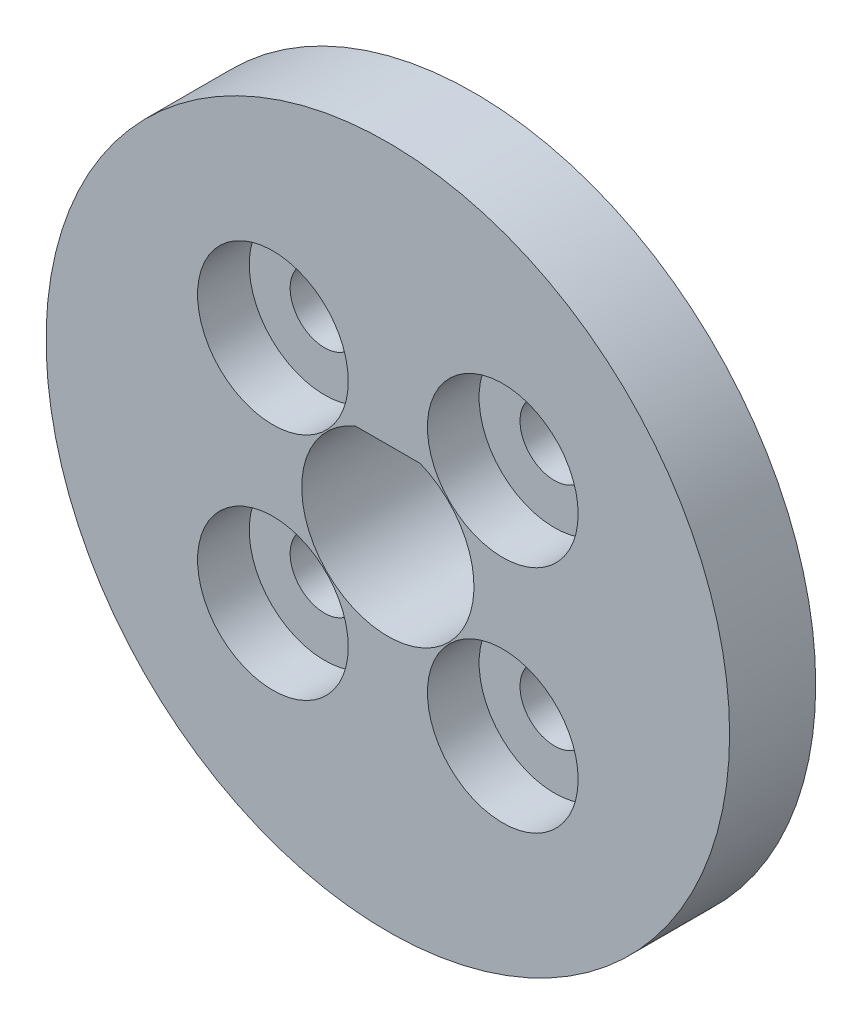
ISO-10303-21;
HEADER;
FILE_DESCRIPTION(('STEP AP214'),'2;1');
FILE_NAME('part.step','',(''),(''),'','','');
FILE_SCHEMA(('AUTOMOTIVE_DESIGN { 1 0 10303 214 1 1 1 1 }'));
ENDSEC;
DATA;
#1=APPLICATION_CONTEXT('core data for automotive mechanical design processes');
#2=APPLICATION_PROTOCOL_DEFINITION('international standard','automotive_design',2000,#1);
#3=PRODUCT_CONTEXT('',#1,'mechanical');
#4=PRODUCT('Part','Part','',(#3));
#5=PRODUCT_RELATED_PRODUCT_CATEGORY('part','',(#4));
#6=PRODUCT_DEFINITION_FORMATION('','',#4);
#7=PRODUCT_DEFINITION_CONTEXT('part definition',#1,'design');
#8=PRODUCT_DEFINITION('design','',#6,#7);
#9=PRODUCT_DEFINITION_SHAPE('','',#8);
#10=(LENGTH_UNIT() NAMED_UNIT(*) SI_UNIT(.MILLI.,.METRE.));
#11=(NAMED_UNIT(*) PLANE_ANGLE_UNIT() SI_UNIT($,.RADIAN.));
#12=(NAMED_UNIT(*) SI_UNIT($,.STERADIAN.) SOLID_ANGLE_UNIT());
#13=UNCERTAINTY_MEASURE_WITH_UNIT(LENGTH_MEASURE(1.E-05),#10,'distance_accuracy_value','');
#14=(GEOMETRIC_REPRESENTATION_CONTEXT(3) GLOBAL_UNCERTAINTY_ASSIGNED_CONTEXT((#13)) GLOBAL_UNIT_ASSIGNED_CONTEXT((#10,
#11,#12)) REPRESENTATION_CONTEXT('',''));
#15=CARTESIAN_POINT('',(0.,0.,0.));
#16=DIRECTION('',(0.,0.,1.));
#17=DIRECTION('',(1.,0.,0.));
#18=AXIS2_PLACEMENT_3D('',#15,#16,#17);
#19=CARTESIAN_POINT('',(15.875,98.8856531004278,-3.));
#20=DIRECTION('',(0.,0.,-1.));
#21=DIRECTION('',(-1.,0.,0.));
#22=AXIS2_PLACEMENT_3D('',#19,#20,#21);
#23=PLANE('',#22);
#24=CARTESIAN_POINT('',(15.875,98.8856531004278,-3.));
#25=DIRECTION('',(0.,0.,-1.));
#26=DIRECTION('',(-1.,0.,0.));
#27=AXIS2_PLACEMENT_3D('',#24,#25,#26);
#28=CIRCLE('',#27,4.);
#29=CARTESIAN_POINT('',(17.375,102.593752343976,-3.));
#30=VERTEX_POINT('',#29);
#31=CARTESIAN_POINT('',(14.375,102.593752343976,-3.));
#32=VERTEX_POINT('',#31);
#33=EDGE_CURVE('E11',#30,#32,#28,.T.);
#34=ORIENTED_EDGE('',*,*,#33,.F.);
#35=DIRECTION('',(1.,0.,0.));
#36=VECTOR('',#35,1.);
#37=CARTESIAN_POINT('',(15.875,102.593752343976,-3.));
#38=LINE('',#37,#36);
#39=EDGE_CURVE('E45',#32,#30,#38,.T.);
#40=ORIENTED_EDGE('',*,*,#39,.F.);
#41=EDGE_LOOP('',(#34,#40));
#42=FACE_BOUND('',#41,.T.);
#43=CARTESIAN_POINT('',(10.5363438020416,104.224309298386,-3.));
#44=DIRECTION('',(0.,0.,1.));
#45=DIRECTION('',(1.,0.,0.));
#46=AXIS2_PLACEMENT_3D('',#43,#44,#45);
#47=CIRCLE('',#46,1.6);
#48=CARTESIAN_POINT('',(12.1363438020416,104.224309298386,-3.));
#49=VERTEX_POINT('',#48);
#50=EDGE_CURVE('E80',#49,#49,#47,.T.);
#51=ORIENTED_EDGE('',*,*,#50,.T.);
#52=EDGE_LOOP('',(#51));
#53=FACE_BOUND('',#52,.T.);
#54=CARTESIAN_POINT('',(21.2136561979584,104.224309298386,-3.));
#55=DIRECTION('',(0.,0.,1.));
#56=DIRECTION('',(1.,0.,0.));
#57=AXIS2_PLACEMENT_3D('',#54,#55,#56);
#58=CIRCLE('',#57,1.6);
#59=CARTESIAN_POINT('',(22.8136561979584,104.224309298386,-3.));
#60=VERTEX_POINT('',#59);
#61=EDGE_CURVE('E84',#60,#60,#58,.T.);
#62=ORIENTED_EDGE('',*,*,#61,.T.);
#63=EDGE_LOOP('',(#62));
#64=FACE_BOUND('',#63,.T.);
#65=CARTESIAN_POINT('',(21.2136561979582,93.5469969024693,-3.));
#66=DIRECTION('',(0.,0.,1.));
#67=DIRECTION('',(1.,0.,0.));
#68=AXIS2_PLACEMENT_3D('',#65,#66,#67);
#69=CIRCLE('',#68,1.6);
#70=CARTESIAN_POINT('',(22.8136561979582,93.5469969024693,-3.));
#71=VERTEX_POINT('',#70);
#72=EDGE_CURVE('E88',#71,#71,#69,.T.);
#73=ORIENTED_EDGE('',*,*,#72,.T.);
#74=EDGE_LOOP('',(#73));
#75=FACE_BOUND('',#74,.T.);
#76=CARTESIAN_POINT('',(15.875,98.8856531004278,-3.));
#77=DIRECTION('',(0.,0.,-1.));
#78=DIRECTION('',(-1.,0.,0.));
#79=AXIS2_PLACEMENT_3D('',#76,#77,#78);
#80=CIRCLE('',#79,10.);
#81=CARTESIAN_POINT('',(5.875,98.8856531004278,-3.));
#82=VERTEX_POINT('',#81);
#83=EDGE_CURVE('E92',#82,#82,#80,.T.);
#84=ORIENTED_EDGE('',*,*,#83,.T.);
#85=EDGE_LOOP('',(#84));
#86=FACE_BOUND('',#85,.T.);
#87=CARTESIAN_POINT('',(10.5363438020413,93.5469969024696,-3.));
#88=DIRECTION('',(0.,0.,1.));
#89=DIRECTION('',(1.,0.,0.));
#90=AXIS2_PLACEMENT_3D('',#87,#88,#89);
#91=CIRCLE('',#90,1.6);
#92=CARTESIAN_POINT('',(12.1363438020413,93.5469969024696,-3.));
#93=VERTEX_POINT('',#92);
#94=EDGE_CURVE('E95',#93,#93,#91,.T.);
#95=ORIENTED_EDGE('',*,*,#94,.T.);
#96=EDGE_LOOP('',(#95));
#97=FACE_BOUND('',#96,.T.);
#98=ADVANCED_FACE('F37',(#42,#53,#64,#75,#86,#97),#23,.T.);
#99=CARTESIAN_POINT('',(15.875,98.8856531004278,4.));
#100=DIRECTION('',(0.,0.,1.));
#101=DIRECTION('',(1.,0.,0.));
#102=AXIS2_PLACEMENT_3D('',#99,#100,#101);
#103=PLANE('',#102);
#104=CARTESIAN_POINT('',(10.5363438020416,104.224309298386,4.));
#105=DIRECTION('',(0.,0.,1.));
#106=DIRECTION('',(1.,0.,0.));
#107=AXIS2_PLACEMENT_3D('',#104,#105,#106);
#108=CIRCLE('',#107,3.5);
#109=CARTESIAN_POINT('',(14.0363438020416,104.224309298386,4.));
#110=VERTEX_POINT('',#109);
#111=EDGE_CURVE('E68',#110,#110,#108,.T.);
#112=ORIENTED_EDGE('',*,*,#111,.F.);
#113=EDGE_LOOP('',(#112));
#114=FACE_BOUND('',#113,.T.);
#115=CARTESIAN_POINT('',(21.2136561979584,104.224309298386,4.));
#116=DIRECTION('',(0.,0.,1.));
#117=DIRECTION('',(1.,0.,0.));
#118=AXIS2_PLACEMENT_3D('',#115,#116,#117);
#119=CIRCLE('',#118,3.5);
#120=CARTESIAN_POINT('',(24.7136561979584,104.224309298386,4.));
#121=VERTEX_POINT('',#120);
#122=EDGE_CURVE('E148',#121,#121,#119,.T.);
#123=ORIENTED_EDGE('',*,*,#122,.F.);
#124=EDGE_LOOP('',(#123));
#125=FACE_BOUND('',#124,.T.);
#126=CARTESIAN_POINT('',(21.2136561979582,93.5469969024693,4.));
#127=DIRECTION('',(0.,0.,1.));
#128=DIRECTION('',(1.,0.,0.));
#129=AXIS2_PLACEMENT_3D('',#126,#127,#128);
#130=CIRCLE('',#129,3.5);
#131=CARTESIAN_POINT('',(24.7136561979582,93.5469969024693,4.));
#132=VERTEX_POINT('',#131);
#133=EDGE_CURVE('E158',#132,#132,#130,.T.);
#134=ORIENTED_EDGE('',*,*,#133,.F.);
#135=EDGE_LOOP('',(#134));
#136=FACE_BOUND('',#135,.T.);
#137=CARTESIAN_POINT('',(10.5363438020413,93.5469969024696,4.));
#138=DIRECTION('',(0.,0.,1.));
#139=DIRECTION('',(1.,0.,0.));
#140=AXIS2_PLACEMENT_3D('',#137,#138,#139);
#141=CIRCLE('',#140,3.5);
#142=CARTESIAN_POINT('',(14.0363438020413,93.5469969024696,4.));
#143=VERTEX_POINT('',#142);
#144=EDGE_CURVE('E168',#143,#143,#141,.T.);
#145=ORIENTED_EDGE('',*,*,#144,.F.);
#146=EDGE_LOOP('',(#145));
#147=FACE_BOUND('',#146,.T.);
#148=CARTESIAN_POINT('',(15.875,98.8856531004278,4.));
#149=DIRECTION('',(0.,0.,1.));
#150=DIRECTION('',(1.,0.,0.));
#151=AXIS2_PLACEMENT_3D('',#148,#149,#150);
#152=CIRCLE('',#151,15.875);
#153=CARTESIAN_POINT('',(31.75,98.8856531004278,4.));
#154=VERTEX_POINT('',#153);
#155=EDGE_CURVE('E107',#154,#154,#152,.T.);
#156=ORIENTED_EDGE('',*,*,#155,.T.);
#157=EDGE_LOOP('',(#156));
#158=FACE_BOUND('',#157,.T.);
#159=CARTESIAN_POINT('',(15.875,98.8856531004278,4.));
#160=DIRECTION('',(0.,0.,1.));
#161=DIRECTION('',(1.,0.,0.));
#162=AXIS2_PLACEMENT_3D('',#159,#160,#161);
#163=CIRCLE('',#162,4.);
#164=CARTESIAN_POINT('',(14.375,102.593752343976,4.));
#165=VERTEX_POINT('',#164);
#166=CARTESIAN_POINT('',(17.375,102.593752343976,4.));
#167=VERTEX_POINT('',#166);
#168=EDGE_CURVE('E67',#165,#167,#163,.T.);
#169=ORIENTED_EDGE('',*,*,#168,.F.);
#170=DIRECTION('',(1.,0.,0.));
#171=VECTOR('',#170,1.);
#172=CARTESIAN_POINT('',(14.375,102.593752343976,4.));
#173=LINE('',#172,#171);
#174=EDGE_CURVE('E135',#165,#167,#173,.T.);
#175=ORIENTED_EDGE('',*,*,#174,.T.);
#176=EDGE_LOOP('',(#169,#175));
#177=FACE_BOUND('',#176,.T.);
#178=ADVANCED_FACE('F75',(#114,#125,#136,#147,#158,#177),#103,.T.);
#179=CARTESIAN_POINT('',(15.875,98.8856531004278,0.));
#180=DIRECTION('',(0.,0.,1.));
#181=DIRECTION('',(1.,0.,0.));
#182=AXIS2_PLACEMENT_3D('',#179,#180,#181);
#183=PLANE('',#182);
#184=CARTESIAN_POINT('',(15.875,98.8856531004278,0.));
#185=DIRECTION('',(0.,0.,1.));
#186=DIRECTION('',(1.,0.,0.));
#187=AXIS2_PLACEMENT_3D('',#184,#185,#186);
#188=CIRCLE('',#187,10.);
#189=CARTESIAN_POINT('',(25.875,98.8856531004278,0.));
#190=VERTEX_POINT('',#189);
#191=EDGE_CURVE('E72',#190,#190,#188,.F.);
#192=ORIENTED_EDGE('',*,*,#191,.F.);
#193=EDGE_LOOP('',(#192));
#194=FACE_BOUND('',#193,.T.);
#195=CARTESIAN_POINT('',(15.875,98.8856531004278,0.));
#196=DIRECTION('',(0.,0.,1.));
#197=DIRECTION('',(1.,0.,0.));
#198=AXIS2_PLACEMENT_3D('',#195,#196,#197);
#199=CIRCLE('',#198,15.875);
#200=CARTESIAN_POINT('',(31.75,98.8856531004278,0.));
#201=VERTEX_POINT('',#200);
#202=EDGE_CURVE('E106',#201,#201,#199,.T.);
#203=ORIENTED_EDGE('',*,*,#202,.F.);
#204=EDGE_LOOP('',(#203));
#205=FACE_BOUND('',#204,.T.);
#206=ADVANCED_FACE('F117',(#194,#205),#183,.F.);
#207=CARTESIAN_POINT('',(15.875,98.8856531004278,4.));
#208=DIRECTION('',(0.,0.,-1.));
#209=DIRECTION('',(-1.,0.,0.));
#210=AXIS2_PLACEMENT_3D('',#207,#208,#209);
#211=CYLINDRICAL_SURFACE('',#210,15.875);
#212=ORIENTED_EDGE('',*,*,#155,.F.);
#213=EDGE_LOOP('',(#212));
#214=FACE_BOUND('',#213,.T.);
#215=ORIENTED_EDGE('',*,*,#202,.T.);
#216=EDGE_LOOP('',(#215));
#217=FACE_BOUND('',#216,.T.);
#218=ADVANCED_FACE('F39',(#214,#217),#211,.T.);
#219=CARTESIAN_POINT('',(15.875,98.8856531004278,4.));
#220=DIRECTION('',(0.,0.,-1.));
#221=DIRECTION('',(-1.,0.,0.));
#222=AXIS2_PLACEMENT_3D('',#219,#220,#221);
#223=CYLINDRICAL_SURFACE('',#222,4.);
#224=DIRECTION('',(0.,0.,1.));
#225=VECTOR('',#224,1.);
#226=CARTESIAN_POINT('',(14.375,102.593752343976,-3.01416755533221));
#227=LINE('',#226,#225);
#228=EDGE_CURVE('E52',#32,#165,#227,.T.);
#229=ORIENTED_EDGE('',*,*,#228,.T.);
#230=ORIENTED_EDGE('',*,*,#168,.T.);
#231=DIRECTION('',(0.,0.,1.));
#232=VECTOR('',#231,1.);
#233=CARTESIAN_POINT('',(17.375,102.593752343976,-3.01416755533221));
#234=LINE('',#233,#232);
#235=EDGE_CURVE('E56',#30,#167,#234,.T.);
#236=ORIENTED_EDGE('',*,*,#235,.F.);
#237=ORIENTED_EDGE('',*,*,#33,.T.);
#238=EDGE_LOOP('',(#229,#230,#236,#237));
#239=FACE_BOUND('',#238,.T.);
#240=ADVANCED_FACE('F63',(#239),#223,.F.);
#241=CARTESIAN_POINT('',(15.875,98.8856531004278,-3.));
#242=DIRECTION('',(0.,0.,1.));
#243=DIRECTION('',(1.,0.,0.));
#244=AXIS2_PLACEMENT_3D('',#241,#242,#243);
#245=CYLINDRICAL_SURFACE('',#244,10.);
#246=ORIENTED_EDGE('',*,*,#83,.F.);
#247=EDGE_LOOP('',(#246));
#248=FACE_BOUND('',#247,.T.);
#249=ORIENTED_EDGE('',*,*,#191,.T.);
#250=EDGE_LOOP('',(#249));
#251=FACE_BOUND('',#250,.T.);
#252=ADVANCED_FACE('F115',(#248,#251),#245,.T.);
#253=CARTESIAN_POINT('',(10.5363438020413,93.5469969024696,4.));
#254=DIRECTION('',(0.,0.,1.));
#255=DIRECTION('',(1.,0.,0.));
#256=AXIS2_PLACEMENT_3D('',#253,#254,#255);
#257=CYLINDRICAL_SURFACE('',#256,1.6);
#258=ORIENTED_EDGE('',*,*,#94,.F.);
#259=EDGE_LOOP('',(#258));
#260=FACE_BOUND('',#259,.T.);
#261=CARTESIAN_POINT('',(10.5363438020413,93.5469969024696,1.6));
#262=DIRECTION('',(0.,0.,1.));
#263=DIRECTION('',(1.,0.,0.));
#264=AXIS2_PLACEMENT_3D('',#261,#262,#263);
#265=CIRCLE('',#264,1.6);
#266=CARTESIAN_POINT('',(12.1363438020413,93.5469969024696,1.6));
#267=VERTEX_POINT('',#266);
#268=EDGE_CURVE('E97',#267,#267,#265,.T.);
#269=ORIENTED_EDGE('',*,*,#268,.T.);
#270=EDGE_LOOP('',(#269));
#271=FACE_BOUND('',#270,.T.);
#272=ADVANCED_FACE('F189',(#260,#271),#257,.F.);
#273=CARTESIAN_POINT('',(12.1363438020413,93.5469969024696,1.6));
#274=DIRECTION('',(0.,0.,-1.));
#275=DIRECTION('',(-1.,0.,0.));
#276=AXIS2_PLACEMENT_3D('',#273,#274,#275);
#277=PLANE('',#276);
#278=ORIENTED_EDGE('',*,*,#268,.F.);
#279=EDGE_LOOP('',(#278));
#280=FACE_BOUND('',#279,.T.);
#281=CARTESIAN_POINT('',(10.5363438020413,93.5469969024696,1.6));
#282=DIRECTION('',(0.,0.,1.));
#283=DIRECTION('',(1.,0.,0.));
#284=AXIS2_PLACEMENT_3D('',#281,#282,#283);
#285=CIRCLE('',#284,3.5);
#286=CARTESIAN_POINT('',(14.0363438020413,93.5469969024696,1.6));
#287=VERTEX_POINT('',#286);
#288=EDGE_CURVE('E101',#287,#287,#285,.T.);
#289=ORIENTED_EDGE('',*,*,#288,.T.);
#290=EDGE_LOOP('',(#289));
#291=FACE_BOUND('',#290,.T.);
#292=ADVANCED_FACE('F173',(#280,#291),#277,.F.);
#293=CARTESIAN_POINT('',(10.5363438020413,93.5469969024696,4.));
#294=DIRECTION('',(0.,0.,1.));
#295=DIRECTION('',(1.,0.,0.));
#296=AXIS2_PLACEMENT_3D('',#293,#294,#295);
#297=CYLINDRICAL_SURFACE('',#296,3.5);
#298=ORIENTED_EDGE('',*,*,#288,.F.);
#299=EDGE_LOOP('',(#298));
#300=FACE_BOUND('',#299,.T.);
#301=ORIENTED_EDGE('',*,*,#144,.T.);
#302=EDGE_LOOP('',(#301));
#303=FACE_BOUND('',#302,.T.);
#304=ADVANCED_FACE('F175',(#300,#303),#297,.F.);
#305=CARTESIAN_POINT('',(21.2136561979582,93.5469969024693,4.));
#306=DIRECTION('',(0.,0.,1.));
#307=DIRECTION('',(1.,0.,0.));
#308=AXIS2_PLACEMENT_3D('',#305,#306,#307);
#309=CYLINDRICAL_SURFACE('',#308,1.6);
#310=ORIENTED_EDGE('',*,*,#72,.F.);
#311=EDGE_LOOP('',(#310));
#312=FACE_BOUND('',#311,.T.);
#313=CARTESIAN_POINT('',(21.2136561979582,93.5469969024693,1.6));
#314=DIRECTION('',(0.,0.,1.));
#315=DIRECTION('',(1.,0.,0.));
#316=AXIS2_PLACEMENT_3D('',#313,#314,#315);
#317=CIRCLE('',#316,1.6);
#318=CARTESIAN_POINT('',(22.8136561979582,93.5469969024693,1.6));
#319=VERTEX_POINT('',#318);
#320=EDGE_CURVE('E164',#319,#319,#317,.T.);
#321=ORIENTED_EDGE('',*,*,#320,.T.);
#322=EDGE_LOOP('',(#321));
#323=FACE_BOUND('',#322,.T.);
#324=ADVANCED_FACE('F178',(#312,#323),#309,.F.);
#325=CARTESIAN_POINT('',(22.8136561979582,93.5469969024693,1.6));
#326=DIRECTION('',(0.,0.,-1.));
#327=DIRECTION('',(-1.,0.,0.));
#328=AXIS2_PLACEMENT_3D('',#325,#326,#327);
#329=PLANE('',#328);
#330=ORIENTED_EDGE('',*,*,#320,.F.);
#331=EDGE_LOOP('',(#330));
#332=FACE_BOUND('',#331,.T.);
#333=CARTESIAN_POINT('',(21.2136561979582,93.5469969024693,1.6));
#334=DIRECTION('',(0.,0.,1.));
#335=DIRECTION('',(1.,0.,0.));
#336=AXIS2_PLACEMENT_3D('',#333,#334,#335);
#337=CIRCLE('',#336,3.5);
#338=CARTESIAN_POINT('',(24.7136561979582,93.5469969024693,1.6));
#339=VERTEX_POINT('',#338);
#340=EDGE_CURVE('E161',#339,#339,#337,.T.);
#341=ORIENTED_EDGE('',*,*,#340,.T.);
#342=EDGE_LOOP('',(#341));
#343=FACE_BOUND('',#342,.T.);
#344=ADVANCED_FACE('F186',(#332,#343),#329,.F.);
#345=CARTESIAN_POINT('',(21.2136561979582,93.5469969024693,4.));
#346=DIRECTION('',(0.,0.,1.));
#347=DIRECTION('',(1.,0.,0.));
#348=AXIS2_PLACEMENT_3D('',#345,#346,#347);
#349=CYLINDRICAL_SURFACE('',#348,3.5);
#350=ORIENTED_EDGE('',*,*,#340,.F.);
#351=EDGE_LOOP('',(#350));
#352=FACE_BOUND('',#351,.T.);
#353=ORIENTED_EDGE('',*,*,#133,.T.);
#354=EDGE_LOOP('',(#353));
#355=FACE_BOUND('',#354,.T.);
#356=ADVANCED_FACE('F230',(#352,#355),#349,.F.);
#357=CARTESIAN_POINT('',(21.2136561979584,104.224309298386,4.));
#358=DIRECTION('',(0.,0.,1.));
#359=DIRECTION('',(1.,0.,0.));
#360=AXIS2_PLACEMENT_3D('',#357,#358,#359);
#361=CYLINDRICAL_SURFACE('',#360,1.6);
#362=ORIENTED_EDGE('',*,*,#61,.F.);
#363=EDGE_LOOP('',(#362));
#364=FACE_BOUND('',#363,.T.);
#365=CARTESIAN_POINT('',(21.2136561979584,104.224309298386,1.6));
#366=DIRECTION('',(0.,0.,1.));
#367=DIRECTION('',(1.,0.,0.));
#368=AXIS2_PLACEMENT_3D('',#365,#366,#367);
#369=CIRCLE('',#368,1.6);
#370=CARTESIAN_POINT('',(22.8136561979584,104.224309298386,1.6));
#371=VERTEX_POINT('',#370);
#372=EDGE_CURVE('E154',#371,#371,#369,.T.);
#373=ORIENTED_EDGE('',*,*,#372,.T.);
#374=EDGE_LOOP('',(#373));
#375=FACE_BOUND('',#374,.T.);
#376=ADVANCED_FACE('F240',(#364,#375),#361,.F.);
#377=CARTESIAN_POINT('',(22.8136561979584,104.224309298386,1.6));
#378=DIRECTION('',(0.,0.,-1.));
#379=DIRECTION('',(-1.,0.,0.));
#380=AXIS2_PLACEMENT_3D('',#377,#378,#379);
#381=PLANE('',#380);
#382=ORIENTED_EDGE('',*,*,#372,.F.);
#383=EDGE_LOOP('',(#382));
#384=FACE_BOUND('',#383,.T.);
#385=CARTESIAN_POINT('',(21.2136561979584,104.224309298386,1.6));
#386=DIRECTION('',(0.,0.,1.));
#387=DIRECTION('',(1.,0.,0.));
#388=AXIS2_PLACEMENT_3D('',#385,#386,#387);
#389=CIRCLE('',#388,3.5);
#390=CARTESIAN_POINT('',(24.7136561979584,104.224309298386,1.6));
#391=VERTEX_POINT('',#390);
#392=EDGE_CURVE('E151',#391,#391,#389,.T.);
#393=ORIENTED_EDGE('',*,*,#392,.T.);
#394=EDGE_LOOP('',(#393));
#395=FACE_BOUND('',#394,.T.);
#396=ADVANCED_FACE('F251',(#384,#395),#381,.F.);
#397=CARTESIAN_POINT('',(21.2136561979584,104.224309298386,4.));
#398=DIRECTION('',(0.,0.,1.));
#399=DIRECTION('',(1.,0.,0.));
#400=AXIS2_PLACEMENT_3D('',#397,#398,#399);
#401=CYLINDRICAL_SURFACE('',#400,3.5);
#402=ORIENTED_EDGE('',*,*,#392,.F.);
#403=EDGE_LOOP('',(#402));
#404=FACE_BOUND('',#403,.T.);
#405=ORIENTED_EDGE('',*,*,#122,.T.);
#406=EDGE_LOOP('',(#405));
#407=FACE_BOUND('',#406,.T.);
#408=ADVANCED_FACE('F262',(#404,#407),#401,.F.);
#409=CARTESIAN_POINT('',(10.5363438020416,104.224309298386,4.));
#410=DIRECTION('',(0.,0.,1.));
#411=DIRECTION('',(1.,0.,0.));
#412=AXIS2_PLACEMENT_3D('',#409,#410,#411);
#413=CYLINDRICAL_SURFACE('',#412,1.6);
#414=ORIENTED_EDGE('',*,*,#50,.F.);
#415=EDGE_LOOP('',(#414));
#416=FACE_BOUND('',#415,.T.);
#417=CARTESIAN_POINT('',(10.5363438020416,104.224309298386,1.6));
#418=DIRECTION('',(0.,0.,1.));
#419=DIRECTION('',(1.,0.,0.));
#420=AXIS2_PLACEMENT_3D('',#417,#418,#419);
#421=CIRCLE('',#420,1.6);
#422=CARTESIAN_POINT('',(12.1363438020416,104.224309298386,1.6));
#423=VERTEX_POINT('',#422);
#424=EDGE_CURVE('E144',#423,#423,#421,.T.);
#425=ORIENTED_EDGE('',*,*,#424,.T.);
#426=EDGE_LOOP('',(#425));
#427=FACE_BOUND('',#426,.T.);
#428=ADVANCED_FACE('F273',(#416,#427),#413,.F.);
#429=CARTESIAN_POINT('',(12.1363438020416,104.224309298386,1.6));
#430=DIRECTION('',(0.,0.,-1.));
#431=DIRECTION('',(-1.,0.,0.));
#432=AXIS2_PLACEMENT_3D('',#429,#430,#431);
#433=PLANE('',#432);
#434=ORIENTED_EDGE('',*,*,#424,.F.);
#435=EDGE_LOOP('',(#434));
#436=FACE_BOUND('',#435,.T.);
#437=CARTESIAN_POINT('',(10.5363438020416,104.224309298386,1.6));
#438=DIRECTION('',(0.,0.,1.));
#439=DIRECTION('',(1.,0.,0.));
#440=AXIS2_PLACEMENT_3D('',#437,#438,#439);
#441=CIRCLE('',#440,3.5);
#442=CARTESIAN_POINT('',(14.0363438020416,104.224309298386,1.6));
#443=VERTEX_POINT('',#442);
#444=EDGE_CURVE('E141',#443,#443,#441,.T.);
#445=ORIENTED_EDGE('',*,*,#444,.T.);
#446=EDGE_LOOP('',(#445));
#447=FACE_BOUND('',#446,.T.);
#448=ADVANCED_FACE('F284',(#436,#447),#433,.F.);
#449=CARTESIAN_POINT('',(10.5363438020416,104.224309298386,4.));
#450=DIRECTION('',(0.,0.,1.));
#451=DIRECTION('',(1.,0.,0.));
#452=AXIS2_PLACEMENT_3D('',#449,#450,#451);
#453=CYLINDRICAL_SURFACE('',#452,3.5);
#454=ORIENTED_EDGE('',*,*,#444,.F.);
#455=EDGE_LOOP('',(#454));
#456=FACE_BOUND('',#455,.T.);
#457=ORIENTED_EDGE('',*,*,#111,.T.);
#458=EDGE_LOOP('',(#457));
#459=FACE_BOUND('',#458,.T.);
#460=ADVANCED_FACE('F295',(#456,#459),#453,.F.);
#461=CARTESIAN_POINT('',(14.375,102.593752343976,-3.01416755533221));
#462=DIRECTION('',(0.,-1.,0.));
#463=DIRECTION('',(0.,0.,-1.));
#464=AXIS2_PLACEMENT_3D('',#461,#462,#463);
#465=PLANE('',#464);
#466=ORIENTED_EDGE('',*,*,#228,.F.);
#467=ORIENTED_EDGE('',*,*,#39,.T.);
#468=ORIENTED_EDGE('',*,*,#235,.T.);
#469=ORIENTED_EDGE('',*,*,#174,.F.);
#470=EDGE_LOOP('',(#466,#467,#468,#469));
#471=FACE_BOUND('',#470,.T.);
#472=ADVANCED_FACE('F70',(#471),#465,.T.);
#473=CLOSED_SHELL('',(#98,#178,#206,#218,#240,#252,#272,#292,#304,#324,#344,#356,#376,#396,#408,
#428,#448,#460,#472));
#474=MANIFOLD_SOLID_BREP('B2',#473);
#475=ADVANCED_BREP_SHAPE_REPRESENTATION('',(#18,#474),#14);
#476=SHAPE_DEFINITION_REPRESENTATION(#9,#475);
ENDSEC;
END-ISO-10303-21;
